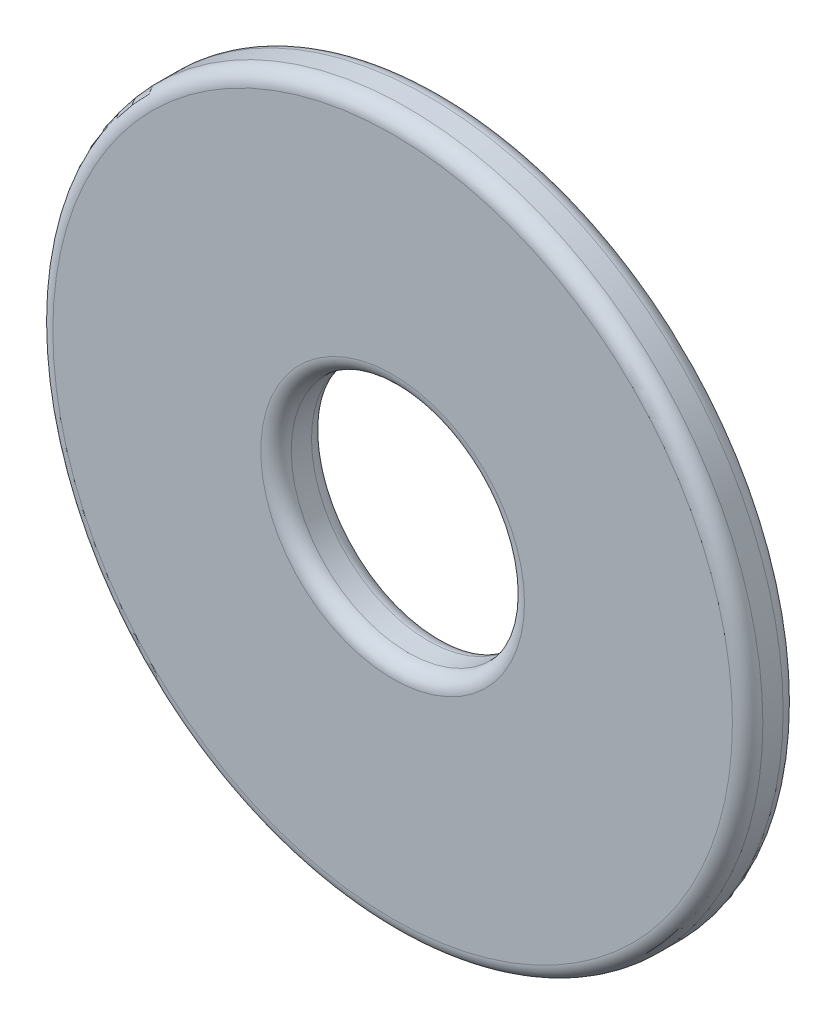
ISO-10303-21;
HEADER;
FILE_DESCRIPTION(('STEP AP214'),'2;1');
FILE_NAME('part.step','',(''),(''),'','','');
FILE_SCHEMA(('AUTOMOTIVE_DESIGN { 1 0 10303 214 1 1 1 1 }'));
ENDSEC;
DATA;
#1=APPLICATION_CONTEXT('core data for automotive mechanical design processes');
#2=APPLICATION_PROTOCOL_DEFINITION('international standard','automotive_design',2000,#1);
#3=PRODUCT_CONTEXT('',#1,'mechanical');
#4=PRODUCT('Part','Part','',(#3));
#5=PRODUCT_RELATED_PRODUCT_CATEGORY('part','',(#4));
#6=PRODUCT_DEFINITION_FORMATION('','',#4);
#7=PRODUCT_DEFINITION_CONTEXT('part definition',#1,'design');
#8=PRODUCT_DEFINITION('design','',#6,#7);
#9=PRODUCT_DEFINITION_SHAPE('','',#8);
#10=(LENGTH_UNIT() NAMED_UNIT(*) SI_UNIT(.MILLI.,.METRE.));
#11=(NAMED_UNIT(*) PLANE_ANGLE_UNIT() SI_UNIT($,.RADIAN.));
#12=(NAMED_UNIT(*) SI_UNIT($,.STERADIAN.) SOLID_ANGLE_UNIT());
#13=UNCERTAINTY_MEASURE_WITH_UNIT(LENGTH_MEASURE(1.E-05),#10,'distance_accuracy_value','');
#14=(GEOMETRIC_REPRESENTATION_CONTEXT(3) GLOBAL_UNCERTAINTY_ASSIGNED_CONTEXT((#13)) GLOBAL_UNIT_ASSIGNED_CONTEXT((#10,
#11,#12)) REPRESENTATION_CONTEXT('',''));
#15=CARTESIAN_POINT('',(0.,0.,0.));
#16=DIRECTION('',(0.,0.,1.));
#17=DIRECTION('',(1.,0.,0.));
#18=AXIS2_PLACEMENT_3D('',#15,#16,#17);
#19=CARTESIAN_POINT('',(0.,0.,0.25));
#20=DIRECTION('',(0.,0.,1.));
#21=DIRECTION('',(1.,0.,0.));
#22=AXIS2_PLACEMENT_3D('',#19,#20,#21);
#23=PLANE('',#22);
#24=CARTESIAN_POINT('',(0.,0.,0.25));
#25=DIRECTION('',(0.,0.,1.));
#26=DIRECTION('',(1.,0.,0.));
#27=AXIS2_PLACEMENT_3D('',#24,#25,#26);
#28=CIRCLE('',#27,1.3);
#29=CARTESIAN_POINT('',(1.3,0.,0.25));
#30=VERTEX_POINT('',#29);
#31=EDGE_CURVE('E47',#30,#30,#28,.F.);
#32=ORIENTED_EDGE('',*,*,#31,.T.);
#33=EDGE_LOOP('',(#32));
#34=FACE_BOUND('',#33,.T.);
#35=CARTESIAN_POINT('',(0.,0.,0.25));
#36=DIRECTION('',(0.,0.,1.));
#37=DIRECTION('',(1.,0.,0.));
#38=AXIS2_PLACEMENT_3D('',#35,#36,#37);
#39=CIRCLE('',#38,3.35);
#40=CARTESIAN_POINT('',(3.35,0.,0.25));
#41=VERTEX_POINT('',#40);
#42=EDGE_CURVE('E51',#41,#41,#39,.T.);
#43=ORIENTED_EDGE('',*,*,#42,.T.);
#44=EDGE_LOOP('',(#43));
#45=FACE_BOUND('',#44,.T.);
#46=ADVANCED_FACE('F36',(#34,#45),#23,.T.);
#47=CARTESIAN_POINT('',(0.,0.,-0.25));
#48=DIRECTION('',(0.,0.,1.));
#49=DIRECTION('',(1.,0.,0.));
#50=AXIS2_PLACEMENT_3D('',#47,#48,#49);
#51=PLANE('',#50);
#52=CARTESIAN_POINT('',(0.,0.,-0.25));
#53=DIRECTION('',(0.,0.,1.));
#54=DIRECTION('',(1.,0.,0.));
#55=AXIS2_PLACEMENT_3D('',#52,#53,#54);
#56=CIRCLE('',#55,1.3);
#57=CARTESIAN_POINT('',(1.3,0.,-0.25));
#58=VERTEX_POINT('',#57);
#59=EDGE_CURVE('E62',#58,#58,#56,.T.);
#60=ORIENTED_EDGE('',*,*,#59,.T.);
#61=EDGE_LOOP('',(#60));
#62=FACE_BOUND('',#61,.T.);
#63=CARTESIAN_POINT('',(0.,0.,-0.25));
#64=DIRECTION('',(0.,0.,1.));
#65=DIRECTION('',(1.,0.,0.));
#66=AXIS2_PLACEMENT_3D('',#63,#64,#65);
#67=CIRCLE('',#66,3.35);
#68=CARTESIAN_POINT('',(3.35,0.,-0.25));
#69=VERTEX_POINT('',#68);
#70=EDGE_CURVE('E65',#69,#69,#67,.F.);
#71=ORIENTED_EDGE('',*,*,#70,.T.);
#72=EDGE_LOOP('',(#71));
#73=FACE_BOUND('',#72,.T.);
#74=ADVANCED_FACE('F69',(#62,#73),#51,.F.);
#75=CARTESIAN_POINT('',(0.,0.,0.25));
#76=DIRECTION('',(0.,0.,-1.));
#77=DIRECTION('',(-1.,0.,0.));
#78=AXIS2_PLACEMENT_3D('',#75,#76,#77);
#79=CYLINDRICAL_SURFACE('',#78,3.5);
#80=CARTESIAN_POINT('',(0.,0.,-0.1));
#81=DIRECTION('',(0.,0.,1.));
#82=DIRECTION('',(1.,0.,0.));
#83=AXIS2_PLACEMENT_3D('',#80,#81,#82);
#84=CIRCLE('',#83,3.5);
#85=CARTESIAN_POINT('',(3.5,0.,-0.1));
#86=VERTEX_POINT('',#85);
#87=EDGE_CURVE('E10',#86,#86,#84,.T.);
#88=ORIENTED_EDGE('',*,*,#87,.T.);
#89=EDGE_LOOP('',(#88));
#90=FACE_BOUND('',#89,.T.);
#91=CARTESIAN_POINT('',(0.,0.,0.1));
#92=DIRECTION('',(0.,0.,1.));
#93=DIRECTION('',(1.,0.,0.));
#94=AXIS2_PLACEMENT_3D('',#91,#92,#93);
#95=CIRCLE('',#94,3.5);
#96=CARTESIAN_POINT('',(3.5,0.,0.1));
#97=VERTEX_POINT('',#96);
#98=EDGE_CURVE('E43',#97,#97,#95,.F.);
#99=ORIENTED_EDGE('',*,*,#98,.T.);
#100=EDGE_LOOP('',(#99));
#101=FACE_BOUND('',#100,.T.);
#102=ADVANCED_FACE('F89',(#90,#101),#79,.T.);
#103=CARTESIAN_POINT('',(0.,0.,0.25));
#104=DIRECTION('',(0.,0.,-1.));
#105=DIRECTION('',(-1.,0.,0.));
#106=AXIS2_PLACEMENT_3D('',#103,#104,#105);
#107=CYLINDRICAL_SURFACE('',#106,1.15);
#108=CARTESIAN_POINT('',(0.,0.,-0.1));
#109=DIRECTION('',(0.,0.,1.));
#110=DIRECTION('',(1.,0.,0.));
#111=AXIS2_PLACEMENT_3D('',#108,#109,#110);
#112=CIRCLE('',#111,1.15);
#113=CARTESIAN_POINT('',(1.15,0.,-0.1));
#114=VERTEX_POINT('',#113);
#115=EDGE_CURVE('E56',#114,#114,#112,.F.);
#116=ORIENTED_EDGE('',*,*,#115,.T.);
#117=EDGE_LOOP('',(#116));
#118=FACE_BOUND('',#117,.T.);
#119=CARTESIAN_POINT('',(0.,0.,0.1));
#120=DIRECTION('',(0.,0.,1.));
#121=DIRECTION('',(1.,0.,0.));
#122=AXIS2_PLACEMENT_3D('',#119,#120,#121);
#123=CIRCLE('',#122,1.15);
#124=CARTESIAN_POINT('',(1.15,0.,0.1));
#125=VERTEX_POINT('',#124);
#126=EDGE_CURVE('E59',#125,#125,#123,.T.);
#127=ORIENTED_EDGE('',*,*,#126,.T.);
#128=EDGE_LOOP('',(#127));
#129=FACE_BOUND('',#128,.T.);
#130=ADVANCED_FACE('F94',(#118,#129),#107,.F.);
#131=CARTESIAN_POINT('',(0.,0.,-0.1));
#132=DIRECTION('',(0.,0.,1.));
#133=DIRECTION('',(1.,0.,0.));
#134=AXIS2_PLACEMENT_3D('',#131,#132,#133);
#135=TOROIDAL_SURFACE('',#134,1.3,0.15);
#136=ORIENTED_EDGE('',*,*,#115,.F.);
#137=EDGE_LOOP('',(#136));
#138=FACE_BOUND('',#137,.T.);
#139=ORIENTED_EDGE('',*,*,#59,.F.);
#140=EDGE_LOOP('',(#139));
#141=FACE_BOUND('',#140,.T.);
#142=ADVANCED_FACE('F80',(#138,#141),#135,.T.);
#143=CARTESIAN_POINT('',(0.,0.,0.1));
#144=DIRECTION('',(0.,0.,1.));
#145=DIRECTION('',(1.,0.,0.));
#146=AXIS2_PLACEMENT_3D('',#143,#144,#145);
#147=TOROIDAL_SURFACE('',#146,1.3,0.15);
#148=ORIENTED_EDGE('',*,*,#31,.F.);
#149=EDGE_LOOP('',(#148));
#150=FACE_BOUND('',#149,.T.);
#151=ORIENTED_EDGE('',*,*,#126,.F.);
#152=EDGE_LOOP('',(#151));
#153=FACE_BOUND('',#152,.T.);
#154=ADVANCED_FACE('F74',(#150,#153),#147,.T.);
#155=CARTESIAN_POINT('',(0.,0.,-0.1));
#156=DIRECTION('',(0.,0.,1.));
#157=DIRECTION('',(1.,0.,0.));
#158=AXIS2_PLACEMENT_3D('',#155,#156,#157);
#159=TOROIDAL_SURFACE('',#158,3.35,0.15);
#160=ORIENTED_EDGE('',*,*,#70,.F.);
#161=EDGE_LOOP('',(#160));
#162=FACE_BOUND('',#161,.T.);
#163=ORIENTED_EDGE('',*,*,#87,.F.);
#164=EDGE_LOOP('',(#163));
#165=FACE_BOUND('',#164,.T.);
#166=ADVANCED_FACE('F71',(#162,#165),#159,.T.);
#167=CARTESIAN_POINT('',(0.,0.,0.1));
#168=DIRECTION('',(0.,0.,1.));
#169=DIRECTION('',(1.,0.,0.));
#170=AXIS2_PLACEMENT_3D('',#167,#168,#169);
#171=TOROIDAL_SURFACE('',#170,3.35,0.15);
#172=ORIENTED_EDGE('',*,*,#98,.F.);
#173=EDGE_LOOP('',(#172));
#174=FACE_BOUND('',#173,.T.);
#175=ORIENTED_EDGE('',*,*,#42,.F.);
#176=EDGE_LOOP('',(#175));
#177=FACE_BOUND('',#176,.T.);
#178=ADVANCED_FACE('F38',(#174,#177),#171,.T.);
#179=CLOSED_SHELL('',(#46,#74,#102,#130,#142,#154,#166,#178));
#180=MANIFOLD_SOLID_BREP('B2',#179);
#181=ADVANCED_BREP_SHAPE_REPRESENTATION('',(#18,#180),#14);
#182=SHAPE_DEFINITION_REPRESENTATION(#9,#181);
ENDSEC;
END-ISO-10303-21;
